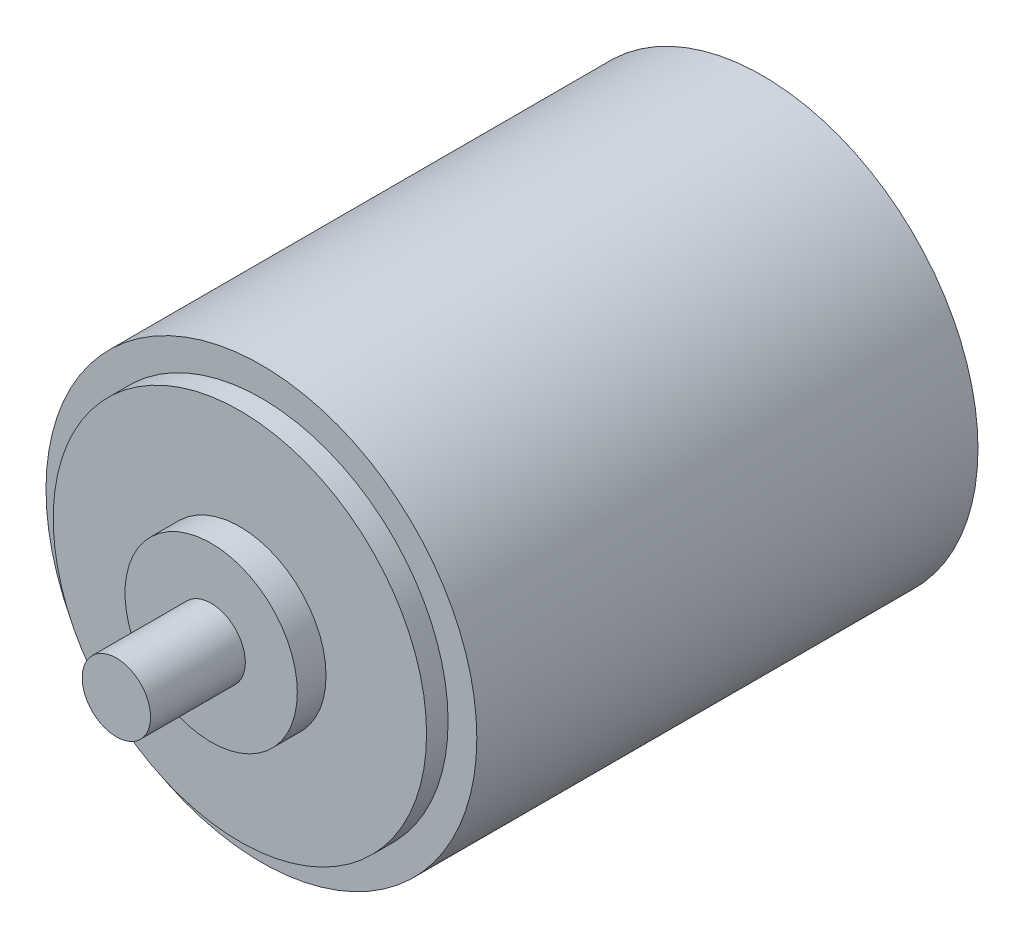
ISO-10303-21;
HEADER;
FILE_DESCRIPTION(('STEP AP214'),'2;1');
FILE_NAME('part.step','',(''),(''),'','','');
FILE_SCHEMA(('AUTOMOTIVE_DESIGN { 1 0 10303 214 1 1 1 1 }'));
ENDSEC;
DATA;
#1=APPLICATION_CONTEXT('core data for automotive mechanical design processes');
#2=APPLICATION_PROTOCOL_DEFINITION('international standard','automotive_design',2000,#1);
#3=PRODUCT_CONTEXT('',#1,'mechanical');
#4=PRODUCT('Part','Part','',(#3));
#5=PRODUCT_RELATED_PRODUCT_CATEGORY('part','',(#4));
#6=PRODUCT_DEFINITION_FORMATION('','',#4);
#7=PRODUCT_DEFINITION_CONTEXT('part definition',#1,'design');
#8=PRODUCT_DEFINITION('design','',#6,#7);
#9=PRODUCT_DEFINITION_SHAPE('','',#8);
#10=(LENGTH_UNIT() NAMED_UNIT(*) SI_UNIT(.MILLI.,.METRE.));
#11=(NAMED_UNIT(*) PLANE_ANGLE_UNIT() SI_UNIT($,.RADIAN.));
#12=(NAMED_UNIT(*) SI_UNIT($,.STERADIAN.) SOLID_ANGLE_UNIT());
#13=UNCERTAINTY_MEASURE_WITH_UNIT(LENGTH_MEASURE(1.E-05),#10,'distance_accuracy_value','');
#14=(GEOMETRIC_REPRESENTATION_CONTEXT(3) GLOBAL_UNCERTAINTY_ASSIGNED_CONTEXT((#13)) GLOBAL_UNIT_ASSIGNED_CONTEXT((#10,
#11,#12)) REPRESENTATION_CONTEXT('',''));
#15=CARTESIAN_POINT('',(0.,0.,0.));
#16=DIRECTION('',(0.,0.,1.));
#17=DIRECTION('',(1.,0.,0.));
#18=AXIS2_PLACEMENT_3D('',#15,#16,#17);
#19=CARTESIAN_POINT('',(0.,0.,0.));
#20=DIRECTION('',(0.,0.,1.));
#21=DIRECTION('',(1.,0.,0.));
#22=AXIS2_PLACEMENT_3D('',#19,#20,#21);
#23=PLANE('',#22);
#24=DIRECTION('',(-1.,0.,0.));
#25=VECTOR('',#24,1.);
#26=CARTESIAN_POINT('',(4.7549973711875,-5.8,0.));
#27=LINE('',#26,#25);
#28=CARTESIAN_POINT('',(4.7549973711875,-5.8,0.));
#29=VERTEX_POINT('',#28);
#30=CARTESIAN_POINT('',(-4.7549973711875,-5.8,0.));
#31=VERTEX_POINT('',#30);
#32=EDGE_CURVE('E49',#29,#31,#27,.T.);
#33=ORIENTED_EDGE('',*,*,#32,.F.);
#34=CARTESIAN_POINT('',(0.,0.,0.));
#35=DIRECTION('',(0.,0.,1.));
#36=DIRECTION('',(1.,0.,0.));
#37=AXIS2_PLACEMENT_3D('',#34,#35,#36);
#38=CIRCLE('',#37,7.5);
#39=EDGE_CURVE('E37',#31,#29,#38,.T.);
#40=ORIENTED_EDGE('',*,*,#39,.F.);
#41=EDGE_LOOP('',(#33,#40));
#42=FACE_BOUND('',#41,.T.);
#43=ADVANCED_FACE('F33',(#42),#23,.F.);
#44=CARTESIAN_POINT('',(0.,0.,15.05));
#45=DIRECTION('',(0.,0.,-1.));
#46=DIRECTION('',(-1.,0.,0.));
#47=AXIS2_PLACEMENT_3D('',#44,#45,#46);
#48=CYLINDRICAL_SURFACE('',#47,7.5);
#49=CARTESIAN_POINT('',(0.,0.,15.05));
#50=DIRECTION('',(0.,0.,1.));
#51=DIRECTION('',(1.,0.,0.));
#52=AXIS2_PLACEMENT_3D('',#49,#50,#51);
#53=CIRCLE('',#52,7.5);
#54=CARTESIAN_POINT('',(7.5,0.,15.05));
#55=VERTEX_POINT('',#54);
#56=EDGE_CURVE('E65',#55,#55,#53,.T.);
#57=ORIENTED_EDGE('',*,*,#56,.F.);
#58=EDGE_LOOP('',(#57));
#59=FACE_BOUND('',#58,.T.);
#60=ORIENTED_EDGE('',*,*,#39,.T.);
#61=DIRECTION('',(0.,0.,1.));
#62=VECTOR('',#61,1.);
#63=CARTESIAN_POINT('',(4.7549973711875,-5.8,-2.4));
#64=LINE('',#63,#62);
#65=CARTESIAN_POINT('',(4.7549973711875,-5.8,-2.4));
#66=VERTEX_POINT('',#65);
#67=EDGE_CURVE('E71',#66,#29,#64,.T.);
#68=ORIENTED_EDGE('',*,*,#67,.F.);
#69=CARTESIAN_POINT('',(0.,0.,-2.4));
#70=DIRECTION('',(0.,0.,-1.));
#71=DIRECTION('',(-1.,0.,0.));
#72=AXIS2_PLACEMENT_3D('',#69,#70,#71);
#73=CIRCLE('',#72,7.5);
#74=CARTESIAN_POINT('',(-4.7549973711875,-5.8,-2.4));
#75=VERTEX_POINT('',#74);
#76=EDGE_CURVE('E72',#75,#66,#73,.T.);
#77=ORIENTED_EDGE('',*,*,#76,.F.);
#78=DIRECTION('',(0.,0.,1.));
#79=VECTOR('',#78,1.);
#80=CARTESIAN_POINT('',(-4.7549973711875,-5.8,-2.4));
#81=LINE('',#80,#79);
#82=EDGE_CURVE('E69',#75,#31,#81,.T.);
#83=ORIENTED_EDGE('',*,*,#82,.T.);
#84=EDGE_LOOP('',(#60,#68,#77,#83));
#85=FACE_BOUND('',#84,.T.);
#86=ADVANCED_FACE('F35',(#59,#85),#48,.T.);
#87=CARTESIAN_POINT('',(0.,0.,15.05));
#88=DIRECTION('',(0.,0.,1.));
#89=DIRECTION('',(1.,0.,0.));
#90=AXIS2_PLACEMENT_3D('',#87,#88,#89);
#91=PLANE('',#90);
#92=CARTESIAN_POINT('',(0.,0.,15.05));
#93=DIRECTION('',(0.,0.,1.));
#94=DIRECTION('',(1.,0.,0.));
#95=AXIS2_PLACEMENT_3D('',#92,#93,#94);
#96=CIRCLE('',#95,6.5);
#97=CARTESIAN_POINT('',(6.5,0.,15.05));
#98=VERTEX_POINT('',#97);
#99=EDGE_CURVE('E86',#98,#98,#96,.T.);
#100=ORIENTED_EDGE('',*,*,#99,.F.);
#101=EDGE_LOOP('',(#100));
#102=FACE_BOUND('',#101,.T.);
#103=ORIENTED_EDGE('',*,*,#56,.T.);
#104=EDGE_LOOP('',(#103));
#105=FACE_BOUND('',#104,.T.);
#106=ADVANCED_FACE('F93',(#102,#105),#91,.T.);
#107=CARTESIAN_POINT('',(0.,0.,15.8));
#108=DIRECTION('',(0.,0.,-1.));
#109=DIRECTION('',(-1.,0.,0.));
#110=AXIS2_PLACEMENT_3D('',#107,#108,#109);
#111=CYLINDRICAL_SURFACE('',#110,6.5);
#112=CARTESIAN_POINT('',(0.,0.,15.8));
#113=DIRECTION('',(0.,0.,1.));
#114=DIRECTION('',(1.,0.,0.));
#115=AXIS2_PLACEMENT_3D('',#112,#113,#114);
#116=CIRCLE('',#115,6.5);
#117=CARTESIAN_POINT('',(6.5,0.,15.8));
#118=VERTEX_POINT('',#117);
#119=EDGE_CURVE('E66',#118,#118,#116,.T.);
#120=ORIENTED_EDGE('',*,*,#119,.F.);
#121=EDGE_LOOP('',(#120));
#122=FACE_BOUND('',#121,.T.);
#123=ORIENTED_EDGE('',*,*,#99,.T.);
#124=EDGE_LOOP('',(#123));
#125=FACE_BOUND('',#124,.T.);
#126=ADVANCED_FACE('F100',(#122,#125),#111,.T.);
#127=CARTESIAN_POINT('',(0.,0.,15.8));
#128=DIRECTION('',(0.,0.,1.));
#129=DIRECTION('',(1.,0.,0.));
#130=AXIS2_PLACEMENT_3D('',#127,#128,#129);
#131=PLANE('',#130);
#132=CARTESIAN_POINT('',(0.,0.,15.8));
#133=DIRECTION('',(0.,0.,1.));
#134=DIRECTION('',(1.,0.,0.));
#135=AXIS2_PLACEMENT_3D('',#132,#133,#134);
#136=CIRCLE('',#135,3.);
#137=CARTESIAN_POINT('',(3.,0.,15.8));
#138=VERTEX_POINT('',#137);
#139=EDGE_CURVE('E42',#138,#138,#136,.T.);
#140=ORIENTED_EDGE('',*,*,#139,.F.);
#141=EDGE_LOOP('',(#140));
#142=FACE_BOUND('',#141,.T.);
#143=ORIENTED_EDGE('',*,*,#119,.T.);
#144=EDGE_LOOP('',(#143));
#145=FACE_BOUND('',#144,.T.);
#146=ADVANCED_FACE('F108',(#142,#145),#131,.T.);
#147=CARTESIAN_POINT('',(0.,0.,16.8));
#148=DIRECTION('',(0.,0.,-1.));
#149=DIRECTION('',(-1.,0.,0.));
#150=AXIS2_PLACEMENT_3D('',#147,#148,#149);
#151=CYLINDRICAL_SURFACE('',#150,3.);
#152=CARTESIAN_POINT('',(0.,0.,16.8));
#153=DIRECTION('',(0.,0.,1.));
#154=DIRECTION('',(1.,0.,0.));
#155=AXIS2_PLACEMENT_3D('',#152,#153,#154);
#156=CIRCLE('',#155,3.);
#157=CARTESIAN_POINT('',(3.,0.,16.8));
#158=VERTEX_POINT('',#157);
#159=EDGE_CURVE('E80',#158,#158,#156,.T.);
#160=ORIENTED_EDGE('',*,*,#159,.F.);
#161=EDGE_LOOP('',(#160));
#162=FACE_BOUND('',#161,.T.);
#163=ORIENTED_EDGE('',*,*,#139,.T.);
#164=EDGE_LOOP('',(#163));
#165=FACE_BOUND('',#164,.T.);
#166=ADVANCED_FACE('F112',(#162,#165),#151,.T.);
#167=CARTESIAN_POINT('',(0.,0.,16.8));
#168=DIRECTION('',(0.,0.,1.));
#169=DIRECTION('',(1.,0.,0.));
#170=AXIS2_PLACEMENT_3D('',#167,#168,#169);
#171=PLANE('',#170);
#172=CARTESIAN_POINT('',(0.,0.,16.8));
#173=DIRECTION('',(0.,0.,1.));
#174=DIRECTION('',(1.,0.,0.));
#175=AXIS2_PLACEMENT_3D('',#172,#173,#174);
#176=CIRCLE('',#175,1.19);
#177=CARTESIAN_POINT('',(1.19,0.,16.8));
#178=VERTEX_POINT('',#177);
#179=EDGE_CURVE('E11',#178,#178,#176,.T.);
#180=ORIENTED_EDGE('',*,*,#179,.F.);
#181=EDGE_LOOP('',(#180));
#182=FACE_BOUND('',#181,.T.);
#183=ORIENTED_EDGE('',*,*,#159,.T.);
#184=EDGE_LOOP('',(#183));
#185=FACE_BOUND('',#184,.T.);
#186=ADVANCED_FACE('F116',(#182,#185),#171,.T.);
#187=CARTESIAN_POINT('',(0.,0.,20.1));
#188=DIRECTION('',(0.,0.,-1.));
#189=DIRECTION('',(-1.,0.,0.));
#190=AXIS2_PLACEMENT_3D('',#187,#188,#189);
#191=CYLINDRICAL_SURFACE('',#190,1.19);
#192=CARTESIAN_POINT('',(0.,0.,20.1));
#193=DIRECTION('',(0.,0.,1.));
#194=DIRECTION('',(1.,0.,0.));
#195=AXIS2_PLACEMENT_3D('',#192,#193,#194);
#196=CIRCLE('',#195,1.19);
#197=CARTESIAN_POINT('',(1.19,0.,20.1));
#198=VERTEX_POINT('',#197);
#199=EDGE_CURVE('E75',#198,#198,#196,.T.);
#200=ORIENTED_EDGE('',*,*,#199,.F.);
#201=EDGE_LOOP('',(#200));
#202=FACE_BOUND('',#201,.T.);
#203=ORIENTED_EDGE('',*,*,#179,.T.);
#204=EDGE_LOOP('',(#203));
#205=FACE_BOUND('',#204,.T.);
#206=ADVANCED_FACE('F120',(#202,#205),#191,.T.);
#207=CARTESIAN_POINT('',(0.,0.,20.1));
#208=DIRECTION('',(0.,0.,1.));
#209=DIRECTION('',(1.,0.,0.));
#210=AXIS2_PLACEMENT_3D('',#207,#208,#209);
#211=PLANE('',#210);
#212=ORIENTED_EDGE('',*,*,#199,.T.);
#213=EDGE_LOOP('',(#212));
#214=FACE_BOUND('',#213,.T.);
#215=ADVANCED_FACE('F124',(#214),#211,.T.);
#216=CARTESIAN_POINT('',(4.7549973711875,-5.8,-2.4));
#217=DIRECTION('',(0.,1.,0.));
#218=DIRECTION('',(0.,0.,1.));
#219=AXIS2_PLACEMENT_3D('',#216,#217,#218);
#220=PLANE('',#219);
#221=ORIENTED_EDGE('',*,*,#32,.T.);
#222=ORIENTED_EDGE('',*,*,#82,.F.);
#223=DIRECTION('',(-1.,0.,0.));
#224=VECTOR('',#223,1.);
#225=CARTESIAN_POINT('',(4.7549973711875,-5.8,-2.4));
#226=LINE('',#225,#224);
#227=EDGE_CURVE('E57',#66,#75,#226,.T.);
#228=ORIENTED_EDGE('',*,*,#227,.F.);
#229=ORIENTED_EDGE('',*,*,#67,.T.);
#230=EDGE_LOOP('',(#221,#222,#228,#229));
#231=FACE_BOUND('',#230,.T.);
#232=ADVANCED_FACE('F68',(#231),#220,.F.);
#233=CARTESIAN_POINT('',(0.,0.,-2.4));
#234=DIRECTION('',(0.,0.,-1.));
#235=DIRECTION('',(-1.,0.,0.));
#236=AXIS2_PLACEMENT_3D('',#233,#234,#235);
#237=PLANE('',#236);
#238=ORIENTED_EDGE('',*,*,#76,.T.);
#239=ORIENTED_EDGE('',*,*,#227,.T.);
#240=EDGE_LOOP('',(#238,#239));
#241=FACE_BOUND('',#240,.T.);
#242=ADVANCED_FACE('F131',(#241),#237,.T.);
#243=CLOSED_SHELL('',(#43,#86,#106,#126,#146,#166,#186,#206,#215,#232,#242));
#244=MANIFOLD_SOLID_BREP('B2',#243);
#245=ADVANCED_BREP_SHAPE_REPRESENTATION('',(#18,#244),#14);
#246=SHAPE_DEFINITION_REPRESENTATION(#9,#245);
ENDSEC;
END-ISO-10303-21;
